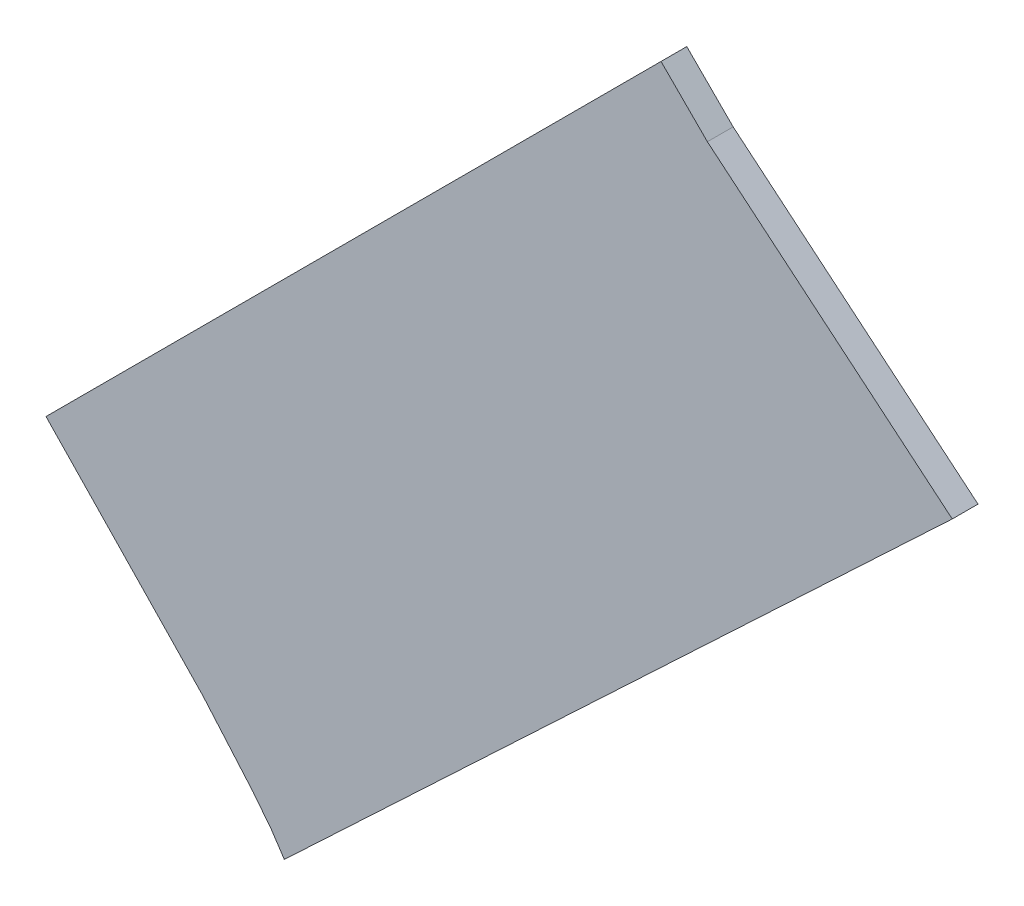
ISO-10303-21;
HEADER;
FILE_DESCRIPTION(('STEP AP214'),'2;1');
FILE_NAME('part.step','',(''),(''),'','','');
FILE_SCHEMA(('AUTOMOTIVE_DESIGN { 1 0 10303 214 1 1 1 1 }'));
ENDSEC;
DATA;
#1=APPLICATION_CONTEXT('core data for automotive mechanical design processes');
#2=APPLICATION_PROTOCOL_DEFINITION('international standard','automotive_design',2000,#1);
#3=PRODUCT_CONTEXT('',#1,'mechanical');
#4=PRODUCT('Part','Part','',(#3));
#5=PRODUCT_RELATED_PRODUCT_CATEGORY('part','',(#4));
#6=PRODUCT_DEFINITION_FORMATION('','',#4);
#7=PRODUCT_DEFINITION_CONTEXT('part definition',#1,'design');
#8=PRODUCT_DEFINITION('design','',#6,#7);
#9=PRODUCT_DEFINITION_SHAPE('','',#8);
#10=(LENGTH_UNIT() NAMED_UNIT(*) SI_UNIT(.MILLI.,.METRE.));
#11=(NAMED_UNIT(*) PLANE_ANGLE_UNIT() SI_UNIT($,.RADIAN.));
#12=(NAMED_UNIT(*) SI_UNIT($,.STERADIAN.) SOLID_ANGLE_UNIT());
#13=UNCERTAINTY_MEASURE_WITH_UNIT(LENGTH_MEASURE(1.E-05),#10,'distance_accuracy_value','');
#14=(GEOMETRIC_REPRESENTATION_CONTEXT(3) GLOBAL_UNCERTAINTY_ASSIGNED_CONTEXT((#13)) GLOBAL_UNIT_ASSIGNED_CONTEXT((#10,
#11,#12)) REPRESENTATION_CONTEXT('',''));
#15=CARTESIAN_POINT('',(0.,0.,0.));
#16=DIRECTION('',(0.,0.,1.));
#17=DIRECTION('',(1.,0.,0.));
#18=AXIS2_PLACEMENT_3D('',#15,#16,#17);
#19=CARTESIAN_POINT('',(37.2620010375977,46.3289985656738,0.));
#20=DIRECTION('',(0.721321868474098,0.692600001487898,0.));
#21=DIRECTION('',(0.692600001487898,-0.721321868474098,0.));
#22=AXIS2_PLACEMENT_3D('',#19,#20,#21);
#23=PLANE('',#22);
#24=DIRECTION('',(0.692600001487898,-0.721321868474098,0.));
#25=VECTOR('',#24,1.);
#26=CARTESIAN_POINT('',(37.2620010375977,46.3289985656738,0.03556));
#27=LINE('',#26,#25);
#28=CARTESIAN_POINT('',(37.2620010375977,46.3289985656738,0.03556));
#29=VERTEX_POINT('',#28);
#30=CARTESIAN_POINT('',(37.4790000915527,46.1030006408691,0.03556));
#31=VERTEX_POINT('',#30);
#32=EDGE_CURVE('E11',#29,#31,#27,.T.);
#33=ORIENTED_EDGE('',*,*,#32,.F.);
#34=DIRECTION('',(0.,0.,1.));
#35=VECTOR('',#34,1.);
#36=CARTESIAN_POINT('',(37.2620010375977,46.3289985656738,0.));
#37=LINE('',#36,#35);
#38=CARTESIAN_POINT('',(37.2620010375977,46.3289985656738,0.));
#39=VERTEX_POINT('',#38);
#40=EDGE_CURVE('E24',#39,#29,#37,.T.);
#41=ORIENTED_EDGE('',*,*,#40,.F.);
#42=DIRECTION('',(0.692600001487898,-0.721321868474098,0.));
#43=VECTOR('',#42,1.);
#44=CARTESIAN_POINT('',(37.2620010375977,46.3289985656738,0.));
#45=LINE('',#44,#43);
#46=CARTESIAN_POINT('',(37.4790000915527,46.1030006408691,0.));
#47=VERTEX_POINT('',#46);
#48=EDGE_CURVE('E100',#39,#47,#45,.T.);
#49=ORIENTED_EDGE('',*,*,#48,.T.);
#50=DIRECTION('',(0.,0.,1.));
#51=VECTOR('',#50,1.);
#52=CARTESIAN_POINT('',(37.4790000915527,46.1030006408691,0.));
#53=LINE('',#52,#51);
#54=EDGE_CURVE('E37',#47,#31,#53,.T.);
#55=ORIENTED_EDGE('',*,*,#54,.T.);
#56=EDGE_LOOP('',(#33,#41,#49,#55));
#57=FACE_BOUND('',#56,.T.);
#58=ADVANCED_FACE('F17',(#57),#23,.F.);
#59=CARTESIAN_POINT('',(37.4790000915527,46.1030006408691,0.));
#60=DIRECTION('',(0.757254769859616,0.653119601240737,0.));
#61=DIRECTION('',(0.653119601240737,-0.757254769859616,0.));
#62=AXIS2_PLACEMENT_3D('',#59,#60,#61);
#63=PLANE('',#62);
#64=DIRECTION('',(0.653119601240737,-0.757254769859616,0.));
#65=VECTOR('',#64,1.);
#66=CARTESIAN_POINT('',(37.4790000915527,46.1030006408691,0.03556));
#67=LINE('',#66,#65);
#68=CARTESIAN_POINT('',(37.5480003356934,46.0229988098144,0.03556));
#69=VERTEX_POINT('',#68);
#70=EDGE_CURVE('E140',#31,#69,#67,.T.);
#71=ORIENTED_EDGE('',*,*,#70,.F.);
#72=ORIENTED_EDGE('',*,*,#54,.F.);
#73=DIRECTION('',(0.653119601240737,-0.757254769859616,0.));
#74=VECTOR('',#73,1.);
#75=CARTESIAN_POINT('',(37.4790000915527,46.1030006408691,0.));
#76=LINE('',#75,#74);
#77=CARTESIAN_POINT('',(37.5480003356934,46.0229988098144,0.));
#78=VERTEX_POINT('',#77);
#79=EDGE_CURVE('E137',#47,#78,#76,.T.);
#80=ORIENTED_EDGE('',*,*,#79,.T.);
#81=DIRECTION('',(0.,0.,1.));
#82=VECTOR('',#81,1.);
#83=CARTESIAN_POINT('',(37.5480003356934,46.0229988098144,0.));
#84=LINE('',#83,#82);
#85=EDGE_CURVE('E135',#78,#69,#84,.T.);
#86=ORIENTED_EDGE('',*,*,#85,.T.);
#87=EDGE_LOOP('',(#71,#72,#80,#86));
#88=FACE_BOUND('',#87,.T.);
#89=ADVANCED_FACE('F148',(#88),#63,.F.);
#90=CARTESIAN_POINT('',(37.5480003356934,46.0229988098144,0.));
#91=DIRECTION('',(0.787984493771576,0.615695084904495,0.));
#92=DIRECTION('',(0.615695084904495,-0.787984493771576,0.));
#93=AXIS2_PLACEMENT_3D('',#90,#91,#92);
#94=PLANE('',#93);
#95=DIRECTION('',(0.615695084904495,-0.787984493771576,0.));
#96=VECTOR('',#95,1.);
#97=CARTESIAN_POINT('',(37.5480003356934,46.0229988098144,0.03556));
#98=LINE('',#97,#96);
#99=CARTESIAN_POINT('',(37.5730018615723,45.9910011291504,0.03556));
#100=VERTEX_POINT('',#99);
#101=EDGE_CURVE('E132',#69,#100,#98,.T.);
#102=ORIENTED_EDGE('',*,*,#101,.F.);
#103=ORIENTED_EDGE('',*,*,#85,.F.);
#104=DIRECTION('',(0.615695084904495,-0.787984493771576,0.));
#105=VECTOR('',#104,1.);
#106=CARTESIAN_POINT('',(37.5480003356934,46.0229988098144,0.));
#107=LINE('',#106,#105);
#108=CARTESIAN_POINT('',(37.5730018615723,45.9910011291504,0.));
#109=VERTEX_POINT('',#108);
#110=EDGE_CURVE('E129',#78,#109,#107,.T.);
#111=ORIENTED_EDGE('',*,*,#110,.T.);
#112=DIRECTION('',(0.,0.,1.));
#113=VECTOR('',#112,1.);
#114=CARTESIAN_POINT('',(37.5730018615723,45.9910011291504,0.));
#115=LINE('',#114,#113);
#116=EDGE_CURVE('E127',#109,#100,#115,.T.);
#117=ORIENTED_EDGE('',*,*,#116,.T.);
#118=EDGE_LOOP('',(#102,#103,#111,#117));
#119=FACE_BOUND('',#118,.T.);
#120=ADVANCED_FACE('F154',(#119),#94,.F.);
#121=CARTESIAN_POINT('',(37.5730018615723,45.9910011291504,0.));
#122=DIRECTION('',(0.832086464736665,0.554645936793951,0.));
#123=DIRECTION('',(0.554645936793951,-0.832086464736665,0.));
#124=AXIS2_PLACEMENT_3D('',#121,#122,#123);
#125=PLANE('',#124);
#126=DIRECTION('',(0.554645936793951,-0.832086464736665,0.));
#127=VECTOR('',#126,1.);
#128=CARTESIAN_POINT('',(37.5730018615723,45.9910011291504,0.03556));
#129=LINE('',#128,#127);
#130=CARTESIAN_POINT('',(37.5909996032715,45.9640007019043,0.03556));
#131=VERTEX_POINT('',#130);
#132=EDGE_CURVE('E124',#100,#131,#129,.T.);
#133=ORIENTED_EDGE('',*,*,#132,.F.);
#134=ORIENTED_EDGE('',*,*,#116,.F.);
#135=DIRECTION('',(0.554645936793951,-0.832086464736665,0.));
#136=VECTOR('',#135,1.);
#137=CARTESIAN_POINT('',(37.5730018615723,45.9910011291504,0.));
#138=LINE('',#137,#136);
#139=CARTESIAN_POINT('',(37.5909996032715,45.9640007019043,0.));
#140=VERTEX_POINT('',#139);
#141=EDGE_CURVE('E121',#109,#140,#138,.T.);
#142=ORIENTED_EDGE('',*,*,#141,.T.);
#143=DIRECTION('',(0.,0.,1.));
#144=VECTOR('',#143,1.);
#145=CARTESIAN_POINT('',(37.5909996032715,45.9640007019043,0.));
#146=LINE('',#145,#144);
#147=EDGE_CURVE('E119',#140,#131,#146,.T.);
#148=ORIENTED_EDGE('',*,*,#147,.T.);
#149=EDGE_LOOP('',(#133,#134,#142,#148));
#150=FACE_BOUND('',#149,.T.);
#151=ADVANCED_FACE('F156',(#150),#125,.F.);
#152=CARTESIAN_POINT('',(37.5909996032715,45.9640007019043,0.));
#153=DIRECTION('',(-0.685462888592095,0.72810756647832,0.));
#154=DIRECTION('',(0.72810756647832,0.685462888592095,0.));
#155=AXIS2_PLACEMENT_3D('',#152,#153,#154);
#156=PLANE('',#155);
#157=DIRECTION('',(0.72810756647832,0.685462888592095,0.));
#158=VECTOR('',#157,1.);
#159=CARTESIAN_POINT('',(37.5909996032715,45.9640007019043,0.03556));
#160=LINE('',#159,#158);
#161=CARTESIAN_POINT('',(38.5130004882812,46.8320007324219,0.03556));
#162=VERTEX_POINT('',#161);
#163=EDGE_CURVE('E116',#131,#162,#160,.T.);
#164=ORIENTED_EDGE('',*,*,#163,.F.);
#165=ORIENTED_EDGE('',*,*,#147,.F.);
#166=DIRECTION('',(0.72810756647832,0.685462888592095,0.));
#167=VECTOR('',#166,1.);
#168=CARTESIAN_POINT('',(37.5909996032715,45.9640007019043,0.));
#169=LINE('',#168,#167);
#170=CARTESIAN_POINT('',(38.5130004882812,46.8320007324219,0.));
#171=VERTEX_POINT('',#170);
#172=EDGE_CURVE('E113',#140,#171,#169,.T.);
#173=ORIENTED_EDGE('',*,*,#172,.T.);
#174=DIRECTION('',(0.,0.,1.));
#175=VECTOR('',#174,1.);
#176=CARTESIAN_POINT('',(38.5130004882812,46.8320007324219,0.));
#177=LINE('',#176,#175);
#178=EDGE_CURVE('E111',#171,#162,#177,.T.);
#179=ORIENTED_EDGE('',*,*,#178,.T.);
#180=EDGE_LOOP('',(#164,#165,#173,#179));
#181=FACE_BOUND('',#180,.T.);
#182=ADVANCED_FACE('F161',(#181),#156,.F.);
#183=CARTESIAN_POINT('',(38.5130004882812,46.8320007324219,0.));
#184=DIRECTION('',(-0.640626686610945,-0.76785249130408,0.));
#185=DIRECTION('',(-0.76785249130408,0.640626686610945,0.));
#186=AXIS2_PLACEMENT_3D('',#183,#184,#185);
#187=PLANE('',#186);
#188=DIRECTION('',(-0.76785249130408,0.640626686610945,0.));
#189=VECTOR('',#188,1.);
#190=CARTESIAN_POINT('',(38.5130004882812,46.8320007324219,0.03556));
#191=LINE('',#190,#189);
#192=CARTESIAN_POINT('',(38.1749992370605,47.1139984130859,0.03556));
#193=VERTEX_POINT('',#192);
#194=EDGE_CURVE('E108',#162,#193,#191,.T.);
#195=ORIENTED_EDGE('',*,*,#194,.F.);
#196=ORIENTED_EDGE('',*,*,#178,.F.);
#197=DIRECTION('',(-0.76785249130408,0.640626686610945,0.));
#198=VECTOR('',#197,1.);
#199=CARTESIAN_POINT('',(38.5130004882812,46.8320007324219,0.));
#200=LINE('',#199,#198);
#201=CARTESIAN_POINT('',(38.1749992370605,47.1139984130859,0.));
#202=VERTEX_POINT('',#201);
#203=EDGE_CURVE('E106',#171,#202,#200,.T.);
#204=ORIENTED_EDGE('',*,*,#203,.T.);
#205=DIRECTION('',(0.,0.,1.));
#206=VECTOR('',#205,1.);
#207=CARTESIAN_POINT('',(38.1749992370605,47.1139984130859,0.));
#208=LINE('',#207,#206);
#209=EDGE_CURVE('E91',#202,#193,#208,.T.);
#210=ORIENTED_EDGE('',*,*,#209,.T.);
#211=EDGE_LOOP('',(#195,#196,#204,#210));
#212=FACE_BOUND('',#211,.T.);
#213=ADVANCED_FACE('F163',(#212),#187,.F.);
#214=CARTESIAN_POINT('',(38.1749992370605,47.1139984130859,0.));
#215=DIRECTION('',(-0.707127853940067,-0.707085707805013,0.));
#216=DIRECTION('',(-0.707085707805013,0.707127853940067,0.));
#217=AXIS2_PLACEMENT_3D('',#214,#215,#216);
#218=PLANE('',#217);
#219=DIRECTION('',(-0.707085707805012,0.707127853940067,0.));
#220=VECTOR('',#219,1.);
#221=CARTESIAN_POINT('',(38.1749992370605,47.1139984130859,0.03556));
#222=LINE('',#221,#220);
#223=CARTESIAN_POINT('',(38.1110000610352,47.1780014038086,0.03556));
#224=VERTEX_POINT('',#223);
#225=EDGE_CURVE('E95',#193,#224,#222,.T.);
#226=ORIENTED_EDGE('',*,*,#225,.F.);
#227=ORIENTED_EDGE('',*,*,#209,.F.);
#228=DIRECTION('',(-0.707085707805012,0.707127853940067,0.));
#229=VECTOR('',#228,1.);
#230=CARTESIAN_POINT('',(38.1749992370605,47.1139984130859,0.));
#231=LINE('',#230,#229);
#232=CARTESIAN_POINT('',(38.1110000610352,47.1780014038086,0.));
#233=VERTEX_POINT('',#232);
#234=EDGE_CURVE('E87',#202,#233,#231,.T.);
#235=ORIENTED_EDGE('',*,*,#234,.T.);
#236=DIRECTION('',(0.,0.,1.));
#237=VECTOR('',#236,1.);
#238=CARTESIAN_POINT('',(38.1110000610352,47.1780014038086,0.));
#239=LINE('',#238,#237);
#240=EDGE_CURVE('E77',#233,#224,#239,.T.);
#241=ORIENTED_EDGE('',*,*,#240,.T.);
#242=EDGE_LOOP('',(#226,#227,#235,#241));
#243=FACE_BOUND('',#242,.T.);
#244=ADVANCED_FACE('F90',(#243),#218,.F.);
#245=CARTESIAN_POINT('',(38.1110000610352,47.1780014038086,0.));
#246=DIRECTION('',(0.707108369756817,-0.707105192612709,0.));
#247=DIRECTION('',(-0.707105192612709,-0.707108369756817,0.));
#248=AXIS2_PLACEMENT_3D('',#245,#246,#247);
#249=PLANE('',#248);
#250=DIRECTION('',(-0.707105192612709,-0.707108369756817,0.));
#251=VECTOR('',#250,1.);
#252=CARTESIAN_POINT('',(38.1110000610352,47.1780014038086,0.03556));
#253=LINE('',#252,#251);
#254=EDGE_CURVE('E83',#224,#29,#253,.T.);
#255=ORIENTED_EDGE('',*,*,#254,.F.);
#256=ORIENTED_EDGE('',*,*,#240,.F.);
#257=DIRECTION('',(-0.707105192612709,-0.707108369756817,0.));
#258=VECTOR('',#257,1.);
#259=CARTESIAN_POINT('',(38.1110000610352,47.1780014038086,0.));
#260=LINE('',#259,#258);
#261=EDGE_CURVE('E81',#233,#39,#260,.T.);
#262=ORIENTED_EDGE('',*,*,#261,.T.);
#263=ORIENTED_EDGE('',*,*,#40,.T.);
#264=EDGE_LOOP('',(#255,#256,#262,#263));
#265=FACE_BOUND('',#264,.T.);
#266=ADVANCED_FACE('F79',(#265),#249,.F.);
#267=CARTESIAN_POINT('',(37.2620010375977,46.3289985656738,0.));
#268=DIRECTION('',(0.,0.,1.));
#269=DIRECTION('',(1.,0.,0.));
#270=AXIS2_PLACEMENT_3D('',#267,#268,#269);
#271=PLANE('',#270);
#272=ORIENTED_EDGE('',*,*,#261,.F.);
#273=ORIENTED_EDGE('',*,*,#234,.F.);
#274=ORIENTED_EDGE('',*,*,#203,.F.);
#275=ORIENTED_EDGE('',*,*,#172,.F.);
#276=ORIENTED_EDGE('',*,*,#141,.F.);
#277=ORIENTED_EDGE('',*,*,#110,.F.);
#278=ORIENTED_EDGE('',*,*,#79,.F.);
#279=ORIENTED_EDGE('',*,*,#48,.F.);
#280=EDGE_LOOP('',(#272,#273,#274,#275,#276,#277,#278,#279));
#281=FACE_BOUND('',#280,.T.);
#282=ADVANCED_FACE('F98',(#281),#271,.F.);
#283=CARTESIAN_POINT('',(37.2620010375977,46.3289985656738,0.03556));
#284=DIRECTION('',(0.,0.,1.));
#285=DIRECTION('',(1.,0.,0.));
#286=AXIS2_PLACEMENT_3D('',#283,#284,#285);
#287=PLANE('',#286);
#288=ORIENTED_EDGE('',*,*,#32,.T.);
#289=ORIENTED_EDGE('',*,*,#70,.T.);
#290=ORIENTED_EDGE('',*,*,#101,.T.);
#291=ORIENTED_EDGE('',*,*,#132,.T.);
#292=ORIENTED_EDGE('',*,*,#163,.T.);
#293=ORIENTED_EDGE('',*,*,#194,.T.);
#294=ORIENTED_EDGE('',*,*,#225,.T.);
#295=ORIENTED_EDGE('',*,*,#254,.T.);
#296=EDGE_LOOP('',(#288,#289,#290,#291,#292,#293,#294,#295));
#297=FACE_BOUND('',#296,.T.);
#298=ADVANCED_FACE('F151',(#297),#287,.T.);
#299=CLOSED_SHELL('',(#58,#89,#120,#151,#182,#213,#244,#266,#282,#298));
#300=MANIFOLD_SOLID_BREP('B1',#299);
#301=ADVANCED_BREP_SHAPE_REPRESENTATION('',(#18,#300),#14);
#302=SHAPE_DEFINITION_REPRESENTATION(#9,#301);
ENDSEC;
END-ISO-10303-21;
